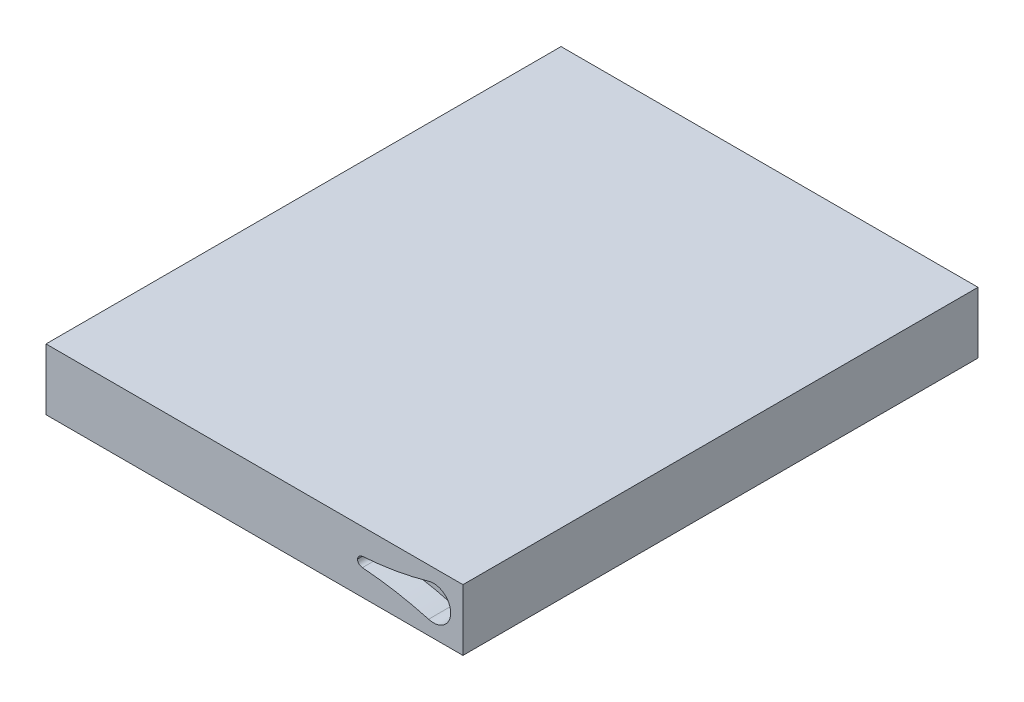
ISO-10303-21;
HEADER;
FILE_DESCRIPTION(('STEP AP214'),'2;1');
FILE_NAME('part.step','',(''),(''),'','','');
FILE_SCHEMA(('AUTOMOTIVE_DESIGN { 1 0 10303 214 1 1 1 1 }'));
ENDSEC;
DATA;
#1=APPLICATION_CONTEXT('core data for automotive mechanical design processes');
#2=APPLICATION_PROTOCOL_DEFINITION('international standard','automotive_design',2000,#1);
#3=PRODUCT_CONTEXT('',#1,'mechanical');
#4=PRODUCT('Part','Part','',(#3));
#5=PRODUCT_RELATED_PRODUCT_CATEGORY('part','',(#4));
#6=PRODUCT_DEFINITION_FORMATION('','',#4);
#7=PRODUCT_DEFINITION_CONTEXT('part definition',#1,'design');
#8=PRODUCT_DEFINITION('design','',#6,#7);
#9=PRODUCT_DEFINITION_SHAPE('','',#8);
#10=(LENGTH_UNIT() NAMED_UNIT(*) SI_UNIT(.MILLI.,.METRE.));
#11=(NAMED_UNIT(*) PLANE_ANGLE_UNIT() SI_UNIT($,.RADIAN.));
#12=(NAMED_UNIT(*) SI_UNIT($,.STERADIAN.) SOLID_ANGLE_UNIT());
#13=UNCERTAINTY_MEASURE_WITH_UNIT(LENGTH_MEASURE(1.E-05),#10,'distance_accuracy_value','');
#14=(GEOMETRIC_REPRESENTATION_CONTEXT(3) GLOBAL_UNCERTAINTY_ASSIGNED_CONTEXT((#13)) GLOBAL_UNIT_ASSIGNED_CONTEXT((#10,
#11,#12)) REPRESENTATION_CONTEXT('',''));
#15=CARTESIAN_POINT('',(0.,0.,0.));
#16=DIRECTION('',(0.,0.,1.));
#17=DIRECTION('',(1.,0.,0.));
#18=AXIS2_PLACEMENT_3D('',#15,#16,#17);
#19=CARTESIAN_POINT('',(0.,12.5,0.));
#20=DIRECTION('',(0.,0.,-1.));
#21=DIRECTION('',(-1.,0.,0.));
#22=AXIS2_PLACEMENT_3D('',#19,#20,#21);
#23=PLANE('',#22);
#24=DIRECTION('',(1.,0.,0.));
#25=VECTOR('',#24,1.);
#26=CARTESIAN_POINT('',(0.,0.,0.));
#27=LINE('',#26,#25);
#28=CARTESIAN_POINT('',(-4.99999999999999,0.,0.));
#29=VERTEX_POINT('',#28);
#30=CARTESIAN_POINT('',(80.,0.,0.));
#31=VERTEX_POINT('',#30);
#32=EDGE_CURVE('E143',#29,#31,#27,.T.);
#33=ORIENTED_EDGE('',*,*,#32,.T.);
#34=DIRECTION('',(0.,-1.,0.));
#35=VECTOR('',#34,1.);
#36=CARTESIAN_POINT('',(80.,12.5,0.));
#37=LINE('',#36,#35);
#38=CARTESIAN_POINT('',(80.,12.5,0.));
#39=VERTEX_POINT('',#38);
#40=EDGE_CURVE('E12',#39,#31,#37,.T.);
#41=ORIENTED_EDGE('',*,*,#40,.F.);
#42=DIRECTION('',(1.,0.,0.));
#43=VECTOR('',#42,1.);
#44=CARTESIAN_POINT('',(0.,12.5,0.));
#45=LINE('',#44,#43);
#46=CARTESIAN_POINT('',(-4.99999999999999,12.5,0.));
#47=VERTEX_POINT('',#46);
#48=EDGE_CURVE('E98',#47,#39,#45,.T.);
#49=ORIENTED_EDGE('',*,*,#48,.F.);
#50=DIRECTION('',(0.,-1.,0.));
#51=VECTOR('',#50,1.);
#52=CARTESIAN_POINT('',(-4.99999999999999,12.5,0.));
#53=LINE('',#52,#51);
#54=EDGE_CURVE('E75',#47,#29,#53,.T.);
#55=ORIENTED_EDGE('',*,*,#54,.T.);
#56=EDGE_LOOP('',(#33,#41,#49,#55));
#57=FACE_BOUND('',#56,.T.);
#58=CARTESIAN_POINT('',(59.5740057832264,6.17599421677323,0.));
#59=DIRECTION('',(0.,0.,1.));
#60=DIRECTION('',(1.,0.,0.));
#61=AXIS2_PLACEMENT_3D('',#58,#59,#60);
#62=CIRCLE('',#61,1.0765524967946);
#63=CARTESIAN_POINT('',(58.5,6.25,0.));
#64=VERTEX_POINT('',#63);
#65=CARTESIAN_POINT('',(59.5000000000056,7.25,0.));
#66=VERTEX_POINT('',#65);
#67=EDGE_CURVE('E89',#64,#66,#62,.F.);
#68=ORIENTED_EDGE('',*,*,#67,.T.);
#69=CARTESIAN_POINT('',(54.9560208388996,73.1943044244566,0.));
#70=DIRECTION('',(0.,0.,1.));
#71=DIRECTION('',(1.,0.,0.));
#72=AXIS2_PLACEMENT_3D('',#69,#70,#71);
#73=CIRCLE('',#72,66.1006734658731);
#74=CARTESIAN_POINT('',(73.,9.60410196624968,0.));
#75=VERTEX_POINT('',#74);
#76=EDGE_CURVE('E184',#66,#75,#73,.T.);
#77=ORIENTED_EDGE('',*,*,#76,.T.);
#78=CARTESIAN_POINT('',(74.,6.25,0.));
#79=DIRECTION('',(0.,0.,1.));
#80=DIRECTION('',(1.,0.,0.));
#81=AXIS2_PLACEMENT_3D('',#78,#79,#80);
#82=CIRCLE('',#81,3.50000000000001);
#83=CARTESIAN_POINT('',(73.,2.89589803375032,0.));
#84=VERTEX_POINT('',#83);
#85=EDGE_CURVE('E189',#84,#75,#82,.T.);
#86=ORIENTED_EDGE('',*,*,#85,.F.);
#87=CARTESIAN_POINT('',(54.231345292948,-64.8500801770038,0.));
#88=DIRECTION('',(0.,0.,1.));
#89=DIRECTION('',(1.,0.,0.));
#90=AXIS2_PLACEMENT_3D('',#87,#88,#89);
#91=CIRCLE('',#90,70.2977948675812);
#92=CARTESIAN_POINT('',(59.5000000000014,5.25,0.));
#93=VERTEX_POINT('',#92);
#94=EDGE_CURVE('E193',#93,#84,#91,.F.);
#95=ORIENTED_EDGE('',*,*,#94,.F.);
#96=CARTESIAN_POINT('',(59.5812669884853,6.33126698848544,0.));
#97=DIRECTION('',(0.,0.,1.));
#98=DIRECTION('',(1.,0.,0.));
#99=AXIS2_PLACEMENT_3D('',#96,#97,#98);
#100=CIRCLE('',#99,1.08431666214516);
#101=EDGE_CURVE('E197',#64,#93,#100,.T.);
#102=ORIENTED_EDGE('',*,*,#101,.F.);
#103=EDGE_LOOP('',(#68,#77,#86,#95,#102));
#104=FACE_BOUND('',#103,.T.);
#105=ADVANCED_FACE('F71',(#57,#104),#23,.F.);
#106=CARTESIAN_POINT('',(0.,12.5,-105.));
#107=DIRECTION('',(0.,0.,-1.));
#108=DIRECTION('',(-1.,0.,0.));
#109=AXIS2_PLACEMENT_3D('',#106,#107,#108);
#110=PLANE('',#109);
#111=DIRECTION('',(1.,0.,0.));
#112=VECTOR('',#111,1.);
#113=CARTESIAN_POINT('',(0.,0.,-105.));
#114=LINE('',#113,#112);
#115=CARTESIAN_POINT('',(-5.,0.,-105.));
#116=VERTEX_POINT('',#115);
#117=CARTESIAN_POINT('',(80.,0.,-105.));
#118=VERTEX_POINT('',#117);
#119=EDGE_CURVE('E122',#116,#118,#114,.T.);
#120=ORIENTED_EDGE('',*,*,#119,.F.);
#121=DIRECTION('',(0.,-1.,0.));
#122=VECTOR('',#121,1.);
#123=CARTESIAN_POINT('',(-5.,12.5,-105.));
#124=LINE('',#123,#122);
#125=CARTESIAN_POINT('',(-5.,12.5,-105.));
#126=VERTEX_POINT('',#125);
#127=EDGE_CURVE('E126',#126,#116,#124,.T.);
#128=ORIENTED_EDGE('',*,*,#127,.F.);
#129=DIRECTION('',(1.,0.,0.));
#130=VECTOR('',#129,1.);
#131=CARTESIAN_POINT('',(0.,12.5,-105.));
#132=LINE('',#131,#130);
#133=CARTESIAN_POINT('',(80.,12.5,-105.));
#134=VERTEX_POINT('',#133);
#135=EDGE_CURVE('E159',#126,#134,#132,.T.);
#136=ORIENTED_EDGE('',*,*,#135,.T.);
#137=DIRECTION('',(0.,-1.,0.));
#138=VECTOR('',#137,1.);
#139=CARTESIAN_POINT('',(80.,12.5,-105.));
#140=LINE('',#139,#138);
#141=EDGE_CURVE('E81',#134,#118,#140,.T.);
#142=ORIENTED_EDGE('',*,*,#141,.T.);
#143=EDGE_LOOP('',(#120,#128,#136,#142));
#144=FACE_BOUND('',#143,.T.);
#145=ADVANCED_FACE('F124',(#144),#110,.T.);
#146=CARTESIAN_POINT('',(0.,0.,0.));
#147=DIRECTION('',(0.,1.,0.));
#148=DIRECTION('',(0.,0.,1.));
#149=AXIS2_PLACEMENT_3D('',#146,#147,#148);
#150=PLANE('',#149);
#151=ORIENTED_EDGE('',*,*,#119,.T.);
#152=DIRECTION('',(0.,0.,-1.));
#153=VECTOR('',#152,1.);
#154=CARTESIAN_POINT('',(80.,0.,0.));
#155=LINE('',#154,#153);
#156=EDGE_CURVE('E134',#31,#118,#155,.T.);
#157=ORIENTED_EDGE('',*,*,#156,.F.);
#158=ORIENTED_EDGE('',*,*,#32,.F.);
#159=DIRECTION('',(0.,0.,1.));
#160=VECTOR('',#159,1.);
#161=CARTESIAN_POINT('',(-5.,0.,-105.));
#162=LINE('',#161,#160);
#163=EDGE_CURVE('E139',#116,#29,#162,.T.);
#164=ORIENTED_EDGE('',*,*,#163,.F.);
#165=EDGE_LOOP('',(#151,#157,#158,#164));
#166=FACE_BOUND('',#165,.T.);
#167=ADVANCED_FACE('F142',(#166),#150,.F.);
#168=CARTESIAN_POINT('',(80.,12.5,0.));
#169=DIRECTION('',(-1.,0.,0.));
#170=DIRECTION('',(0.,0.,1.));
#171=AXIS2_PLACEMENT_3D('',#168,#169,#170);
#172=PLANE('',#171);
#173=ORIENTED_EDGE('',*,*,#156,.T.);
#174=ORIENTED_EDGE('',*,*,#141,.F.);
#175=DIRECTION('',(0.,0.,-1.));
#176=VECTOR('',#175,1.);
#177=CARTESIAN_POINT('',(80.,12.5,0.));
#178=LINE('',#177,#176);
#179=EDGE_CURVE('E164',#39,#134,#178,.T.);
#180=ORIENTED_EDGE('',*,*,#179,.F.);
#181=ORIENTED_EDGE('',*,*,#40,.T.);
#182=EDGE_LOOP('',(#173,#174,#180,#181));
#183=FACE_BOUND('',#182,.T.);
#184=ADVANCED_FACE('F275',(#183),#172,.F.);
#185=CARTESIAN_POINT('',(0.,12.5,0.));
#186=DIRECTION('',(0.,1.,0.));
#187=DIRECTION('',(0.,0.,1.));
#188=AXIS2_PLACEMENT_3D('',#185,#186,#187);
#189=PLANE('',#188);
#190=ORIENTED_EDGE('',*,*,#135,.F.);
#191=DIRECTION('',(0.,0.,1.));
#192=VECTOR('',#191,1.);
#193=CARTESIAN_POINT('',(-5.,12.5,-105.));
#194=LINE('',#193,#192);
#195=EDGE_CURVE('E140',#126,#47,#194,.T.);
#196=ORIENTED_EDGE('',*,*,#195,.T.);
#197=ORIENTED_EDGE('',*,*,#48,.T.);
#198=ORIENTED_EDGE('',*,*,#179,.T.);
#199=EDGE_LOOP('',(#190,#196,#197,#198));
#200=FACE_BOUND('',#199,.T.);
#201=ADVANCED_FACE('F282',(#200),#189,.T.);
#202=CARTESIAN_POINT('',(-5.,12.5,-105.));
#203=DIRECTION('',(1.,0.,0.));
#204=DIRECTION('',(0.,0.,-1.));
#205=AXIS2_PLACEMENT_3D('',#202,#203,#204);
#206=PLANE('',#205);
#207=ORIENTED_EDGE('',*,*,#163,.T.);
#208=ORIENTED_EDGE('',*,*,#54,.F.);
#209=ORIENTED_EDGE('',*,*,#195,.F.);
#210=ORIENTED_EDGE('',*,*,#127,.T.);
#211=EDGE_LOOP('',(#207,#208,#209,#210));
#212=FACE_BOUND('',#211,.T.);
#213=ADVANCED_FACE('F73',(#212),#206,.F.);
#214=CARTESIAN_POINT('',(59.5740057832264,6.17599421677323,-5.));
#215=DIRECTION('',(0.,0.,1.));
#216=DIRECTION('',(1.,0.,0.));
#217=AXIS2_PLACEMENT_3D('',#214,#215,#216);
#218=CYLINDRICAL_SURFACE('',#217,1.0765524967946);
#219=ORIENTED_EDGE('',*,*,#67,.F.);
#220=DIRECTION('',(0.,0.,1.));
#221=VECTOR('',#220,1.);
#222=CARTESIAN_POINT('',(58.5,6.25,-5.));
#223=LINE('',#222,#221);
#224=CARTESIAN_POINT('',(58.5,6.25,-5.));
#225=VERTEX_POINT('',#224);
#226=EDGE_CURVE('E169',#225,#64,#223,.T.);
#227=ORIENTED_EDGE('',*,*,#226,.F.);
#228=CARTESIAN_POINT('',(59.5740057832264,6.17599421677323,-5.));
#229=DIRECTION('',(0.,0.,1.));
#230=DIRECTION('',(1.,0.,0.));
#231=AXIS2_PLACEMENT_3D('',#228,#229,#230);
#232=CIRCLE('',#231,1.0765524967946);
#233=CARTESIAN_POINT('',(59.5000000000056,7.25,-5.));
#234=VERTEX_POINT('',#233);
#235=EDGE_CURVE('E188',#225,#234,#232,.F.);
#236=ORIENTED_EDGE('',*,*,#235,.T.);
#237=DIRECTION('',(0.,0.,1.));
#238=VECTOR('',#237,1.);
#239=CARTESIAN_POINT('',(59.5000000000056,7.25,-5.));
#240=LINE('',#239,#238);
#241=EDGE_CURVE('E146',#234,#66,#240,.T.);
#242=ORIENTED_EDGE('',*,*,#241,.T.);
#243=EDGE_LOOP('',(#219,#227,#236,#242));
#244=FACE_BOUND('',#243,.T.);
#245=ADVANCED_FACE('F223',(#244),#218,.F.);
#246=CARTESIAN_POINT('',(54.9560208388996,73.1943044244566,-5.));
#247=DIRECTION('',(0.,0.,1.));
#248=DIRECTION('',(1.,0.,0.));
#249=AXIS2_PLACEMENT_3D('',#246,#247,#248);
#250=CYLINDRICAL_SURFACE('',#249,66.1006734658731);
#251=ORIENTED_EDGE('',*,*,#76,.F.);
#252=ORIENTED_EDGE('',*,*,#241,.F.);
#253=CARTESIAN_POINT('',(54.9560208388996,73.1943044244566,-5.));
#254=DIRECTION('',(0.,0.,1.));
#255=DIRECTION('',(1.,0.,0.));
#256=AXIS2_PLACEMENT_3D('',#253,#254,#255);
#257=CIRCLE('',#256,66.1006734658731);
#258=CARTESIAN_POINT('',(73.,9.60410196624968,-5.));
#259=VERTEX_POINT('',#258);
#260=EDGE_CURVE('E173',#234,#259,#257,.T.);
#261=ORIENTED_EDGE('',*,*,#260,.T.);
#262=DIRECTION('',(0.,0.,1.));
#263=VECTOR('',#262,1.);
#264=CARTESIAN_POINT('',(73.,9.60410196624968,-5.));
#265=LINE('',#264,#263);
#266=EDGE_CURVE('E152',#259,#75,#265,.T.);
#267=ORIENTED_EDGE('',*,*,#266,.T.);
#268=EDGE_LOOP('',(#251,#252,#261,#267));
#269=FACE_BOUND('',#268,.T.);
#270=ADVANCED_FACE('F233',(#269),#250,.T.);
#271=CARTESIAN_POINT('',(74.,6.25,-5.));
#272=DIRECTION('',(0.,0.,1.));
#273=DIRECTION('',(1.,0.,0.));
#274=AXIS2_PLACEMENT_3D('',#271,#272,#273);
#275=CYLINDRICAL_SURFACE('',#274,3.50000000000001);
#276=ORIENTED_EDGE('',*,*,#85,.T.);
#277=ORIENTED_EDGE('',*,*,#266,.F.);
#278=CARTESIAN_POINT('',(74.,6.25,-5.));
#279=DIRECTION('',(0.,0.,1.));
#280=DIRECTION('',(1.,0.,0.));
#281=AXIS2_PLACEMENT_3D('',#278,#279,#280);
#282=CIRCLE('',#281,3.50000000000001);
#283=CARTESIAN_POINT('',(73.,2.89589803375032,-5.));
#284=VERTEX_POINT('',#283);
#285=EDGE_CURVE('E206',#284,#259,#282,.T.);
#286=ORIENTED_EDGE('',*,*,#285,.F.);
#287=DIRECTION('',(0.,0.,1.));
#288=VECTOR('',#287,1.);
#289=CARTESIAN_POINT('',(73.,2.89589803375032,-5.));
#290=LINE('',#289,#288);
#291=EDGE_CURVE('E177',#284,#84,#290,.T.);
#292=ORIENTED_EDGE('',*,*,#291,.T.);
#293=EDGE_LOOP('',(#276,#277,#286,#292));
#294=FACE_BOUND('',#293,.T.);
#295=ADVANCED_FACE('F290',(#294),#275,.F.);
#296=CARTESIAN_POINT('',(54.231345292948,-64.8500801770038,-5.));
#297=DIRECTION('',(0.,0.,1.));
#298=DIRECTION('',(1.,0.,0.));
#299=AXIS2_PLACEMENT_3D('',#296,#297,#298);
#300=CYLINDRICAL_SURFACE('',#299,70.2977948675812);
#301=ORIENTED_EDGE('',*,*,#94,.T.);
#302=ORIENTED_EDGE('',*,*,#291,.F.);
#303=CARTESIAN_POINT('',(54.231345292948,-64.8500801770038,-5.));
#304=DIRECTION('',(0.,0.,1.));
#305=DIRECTION('',(1.,0.,0.));
#306=AXIS2_PLACEMENT_3D('',#303,#304,#305);
#307=CIRCLE('',#306,70.2977948675812);
#308=CARTESIAN_POINT('',(59.5000000000014,5.25,-5.));
#309=VERTEX_POINT('',#308);
#310=EDGE_CURVE('E210',#309,#284,#307,.F.);
#311=ORIENTED_EDGE('',*,*,#310,.F.);
#312=DIRECTION('',(0.,0.,1.));
#313=VECTOR('',#312,1.);
#314=CARTESIAN_POINT('',(59.5000000000014,5.25,-5.));
#315=LINE('',#314,#313);
#316=EDGE_CURVE('E172',#309,#93,#315,.T.);
#317=ORIENTED_EDGE('',*,*,#316,.T.);
#318=EDGE_LOOP('',(#301,#302,#311,#317));
#319=FACE_BOUND('',#318,.T.);
#320=ADVANCED_FACE('F257',(#319),#300,.T.);
#321=CARTESIAN_POINT('',(59.5812669884853,6.33126698848544,-5.));
#322=DIRECTION('',(0.,0.,1.));
#323=DIRECTION('',(1.,0.,0.));
#324=AXIS2_PLACEMENT_3D('',#321,#322,#323);
#325=CYLINDRICAL_SURFACE('',#324,1.08431666214516);
#326=ORIENTED_EDGE('',*,*,#101,.T.);
#327=ORIENTED_EDGE('',*,*,#316,.F.);
#328=CARTESIAN_POINT('',(59.5812669884853,6.33126698848544,-5.));
#329=DIRECTION('',(0.,0.,1.));
#330=DIRECTION('',(1.,0.,0.));
#331=AXIS2_PLACEMENT_3D('',#328,#329,#330);
#332=CIRCLE('',#331,1.08431666214516);
#333=EDGE_CURVE('E214',#225,#309,#332,.T.);
#334=ORIENTED_EDGE('',*,*,#333,.F.);
#335=ORIENTED_EDGE('',*,*,#226,.T.);
#336=EDGE_LOOP('',(#326,#327,#334,#335));
#337=FACE_BOUND('',#336,.T.);
#338=ADVANCED_FACE('F255',(#337),#325,.F.);
#339=CARTESIAN_POINT('',(0.,0.,-5.));
#340=DIRECTION('',(0.,0.,1.));
#341=DIRECTION('',(1.,0.,0.));
#342=AXIS2_PLACEMENT_3D('',#339,#340,#341);
#343=PLANE('',#342);
#344=ORIENTED_EDGE('',*,*,#235,.F.);
#345=ORIENTED_EDGE('',*,*,#333,.T.);
#346=ORIENTED_EDGE('',*,*,#310,.T.);
#347=ORIENTED_EDGE('',*,*,#285,.T.);
#348=ORIENTED_EDGE('',*,*,#260,.F.);
#349=EDGE_LOOP('',(#344,#345,#346,#347,#348));
#350=FACE_BOUND('',#349,.T.);
#351=ADVANCED_FACE('F259',(#350),#343,.T.);
#352=CLOSED_SHELL('',(#105,#145,#167,#184,#201,#213,#245,#270,#295,#320,#338,#351));
#353=MANIFOLD_SOLID_BREP('B2',#352);
#354=ADVANCED_BREP_SHAPE_REPRESENTATION('',(#18,#353),#14);
#355=SHAPE_DEFINITION_REPRESENTATION(#9,#354);
ENDSEC;
END-ISO-10303-21;
